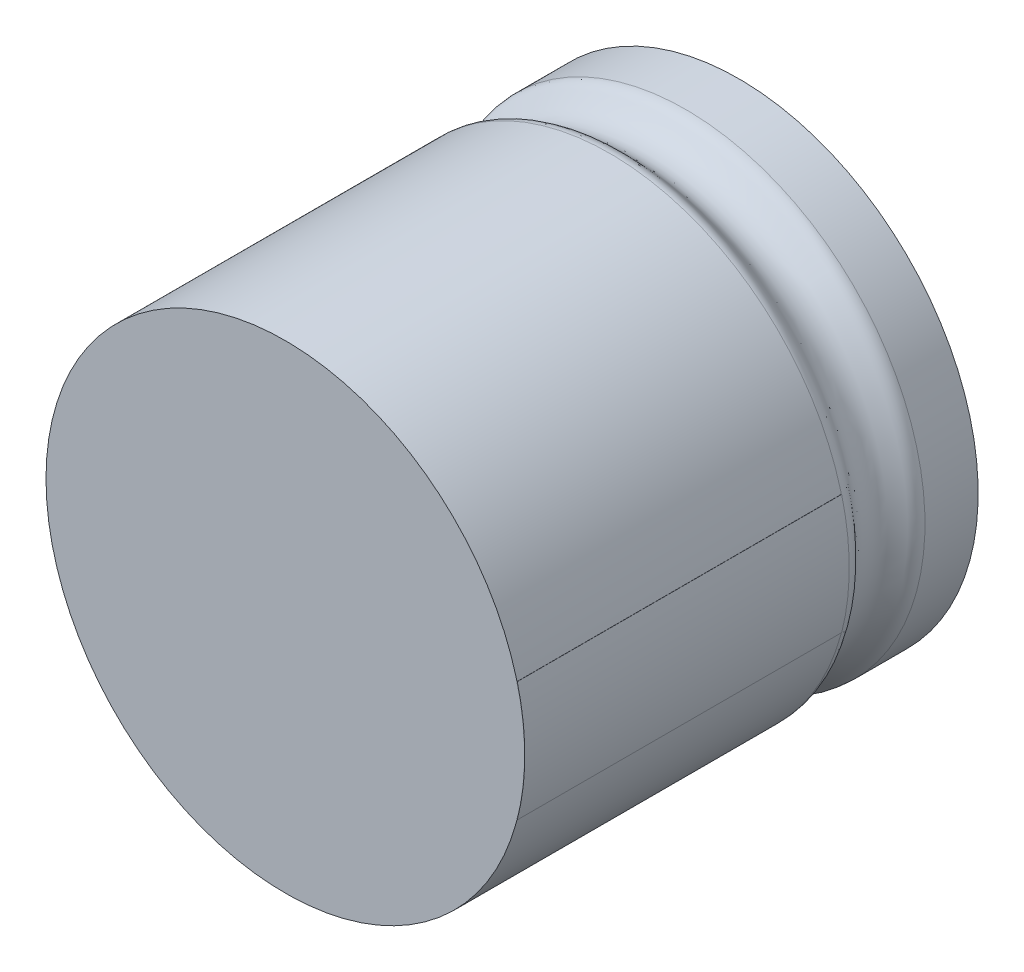
ISO-10303-21;
HEADER;
FILE_DESCRIPTION(('STEP AP214'),'2;1');
FILE_NAME('part.step','',(''),(''),'','','');
FILE_SCHEMA(('AUTOMOTIVE_DESIGN { 1 0 10303 214 1 1 1 1 }'));
ENDSEC;
DATA;
#1=APPLICATION_CONTEXT('core data for automotive mechanical design processes');
#2=APPLICATION_PROTOCOL_DEFINITION('international standard','automotive_design',2000,#1);
#3=PRODUCT_CONTEXT('',#1,'mechanical');
#4=PRODUCT('Part','Part','',(#3));
#5=PRODUCT_RELATED_PRODUCT_CATEGORY('part','',(#4));
#6=PRODUCT_DEFINITION_FORMATION('','',#4);
#7=PRODUCT_DEFINITION_CONTEXT('part definition',#1,'design');
#8=PRODUCT_DEFINITION('design','',#6,#7);
#9=PRODUCT_DEFINITION_SHAPE('','',#8);
#10=(LENGTH_UNIT() NAMED_UNIT(*) SI_UNIT(.MILLI.,.METRE.));
#11=(NAMED_UNIT(*) PLANE_ANGLE_UNIT() SI_UNIT($,.RADIAN.));
#12=(NAMED_UNIT(*) SI_UNIT($,.STERADIAN.) SOLID_ANGLE_UNIT());
#13=UNCERTAINTY_MEASURE_WITH_UNIT(LENGTH_MEASURE(1.E-05),#10,'distance_accuracy_value','');
#14=(GEOMETRIC_REPRESENTATION_CONTEXT(3) GLOBAL_UNCERTAINTY_ASSIGNED_CONTEXT((#13)) GLOBAL_UNIT_ASSIGNED_CONTEXT((#10,
#11,#12)) REPRESENTATION_CONTEXT('',''));
#15=CARTESIAN_POINT('',(0.,0.,0.));
#16=DIRECTION('',(0.,0.,1.));
#17=DIRECTION('',(1.,0.,0.));
#18=AXIS2_PLACEMENT_3D('',#15,#16,#17);
#19=CARTESIAN_POINT('',(5.08813187108,1.31375,21.34375));
#20=DIRECTION('',(-0.249999999999965,0.968245836551863,0.));
#21=DIRECTION('',(0.,0.,1.));
#22=AXIS2_PLACEMENT_3D('',#19,#20,#21);
#23=PLANE('',#22);
#24=DIRECTION('',(0.,0.,-1.));
#25=VECTOR('',#24,1.);
#26=CARTESIAN_POINT('',(5.083290641897,1.3125,21.34375));
#27=LINE('',#26,#25);
#28=CARTESIAN_POINT('',(5.083290641897,1.3125,9.950000000002));
#29=VERTEX_POINT('',#28);
#30=CARTESIAN_POINT('',(5.083290641897,1.3125,2.833333333333));
#31=VERTEX_POINT('',#30);
#32=EDGE_CURVE('P0_E108',#29,#31,#27,.T.);
#33=ORIENTED_EDGE('',*,*,#32,.F.);
#34=DIRECTION('',(0.968245836551863,0.249999999999965,0.));
#35=VECTOR('',#34,1.);
#36=CARTESIAN_POINT('',(5.08813187108,1.31375,9.950000000002));
#37=LINE('',#36,#35);
#38=CARTESIAN_POINT('',(5.08813187108,1.31375,9.950000000002));
#39=VERTEX_POINT('',#38);
#40=EDGE_CURVE('P0_E74',#29,#39,#37,.T.);
#41=ORIENTED_EDGE('',*,*,#40,.T.);
#42=DIRECTION('',(0.,0.,1.));
#43=VECTOR('',#42,1.);
#44=CARTESIAN_POINT('',(5.08813187108,1.31375,2.833333333333));
#45=LINE('',#44,#43);
#46=CARTESIAN_POINT('',(5.08813187108,1.31375,2.833333333333));
#47=VERTEX_POINT('',#46);
#48=EDGE_CURVE('P0_E112',#47,#39,#45,.T.);
#49=ORIENTED_EDGE('',*,*,#48,.F.);
#50=DIRECTION('',(0.968245836551863,0.249999999999965,0.));
#51=VECTOR('',#50,1.);
#52=CARTESIAN_POINT('',(5.083290641897,1.3125,2.833333333333));
#53=LINE('',#52,#51);
#54=EDGE_CURVE('P0_E99',#31,#47,#53,.T.);
#55=ORIENTED_EDGE('',*,*,#54,.F.);
#56=EDGE_LOOP('',(#33,#41,#49,#55));
#57=FACE_BOUND('',#56,.T.);
#58=ADVANCED_FACE('P0_F51',(#57),#23,.T.);
#59=CARTESIAN_POINT('',(5.08813187108,-1.31375,21.34375));
#60=DIRECTION('',(0.249999999999965,0.968245836551863,0.));
#61=DIRECTION('',(0.,0.,-1.));
#62=AXIS2_PLACEMENT_3D('',#59,#60,#61);
#63=PLANE('',#62);
#64=DIRECTION('',(0.968245836551863,-0.249999999999965,0.));
#65=VECTOR('',#64,1.);
#66=CARTESIAN_POINT('',(5.08813187108,-1.31375,9.950000000002));
#67=LINE('',#66,#65);
#68=CARTESIAN_POINT('',(5.08329064189722,-1.31250000000006,9.950000000002));
#69=VERTEX_POINT('',#68);
#70=CARTESIAN_POINT('',(5.08813187108,-1.31375,9.950000000002));
#71=VERTEX_POINT('',#70);
#72=EDGE_CURVE('P0_E102',#69,#71,#67,.T.);
#73=ORIENTED_EDGE('',*,*,#72,.F.);
#74=DIRECTION('',(0.,0.,-1.));
#75=VECTOR('',#74,1.);
#76=CARTESIAN_POINT('',(5.083290641897,-1.3125,21.34375));
#77=LINE('',#76,#75);
#78=CARTESIAN_POINT('',(5.083290641897,-1.3125,2.833333333333));
#79=VERTEX_POINT('',#78);
#80=EDGE_CURVE('P0_E92',#69,#79,#77,.T.);
#81=ORIENTED_EDGE('',*,*,#80,.T.);
#82=DIRECTION('',(0.968245836551863,-0.249999999999965,0.));
#83=VECTOR('',#82,1.);
#84=CARTESIAN_POINT('',(5.083290641897,-1.3125,2.833333333333));
#85=LINE('',#84,#83);
#86=CARTESIAN_POINT('',(5.08813187108,-1.31375,2.833333333333));
#87=VERTEX_POINT('',#86);
#88=EDGE_CURVE('P0_E113',#79,#87,#85,.T.);
#89=ORIENTED_EDGE('',*,*,#88,.T.);
#90=DIRECTION('',(0.,0.,1.));
#91=VECTOR('',#90,1.);
#92=CARTESIAN_POINT('',(5.08813187108,-1.31375,2.833333333333));
#93=LINE('',#92,#91);
#94=EDGE_CURVE('P0_E59',#87,#71,#93,.T.);
#95=ORIENTED_EDGE('',*,*,#94,.T.);
#96=EDGE_LOOP('',(#73,#81,#89,#95));
#97=FACE_BOUND('',#96,.T.);
#98=ADVANCED_FACE('P0_F103',(#97),#63,.F.);
#99=CARTESIAN_POINT('',(0.,0.,2.833333333333));
#100=DIRECTION('',(0.,0.,1.));
#101=DIRECTION('',(0.968245836551863,-0.249999999999965,0.));
#102=AXIS2_PLACEMENT_3D('',#99,#100,#101);
#103=CYLINDRICAL_SURFACE('',#102,5.255);
#104=ORIENTED_EDGE('',*,*,#48,.T.);
#105=CARTESIAN_POINT('',(0.,0.,9.950000000002));
#106=DIRECTION('',(0.,0.,1.));
#107=DIRECTION('',(1.,0.,0.));
#108=AXIS2_PLACEMENT_3D('',#105,#106,#107);
#109=CIRCLE('',#108,5.255);
#110=EDGE_CURVE('P0_E66',#39,#71,#109,.F.);
#111=ORIENTED_EDGE('',*,*,#110,.T.);
#112=ORIENTED_EDGE('',*,*,#94,.F.);
#113=CARTESIAN_POINT('',(0.,0.,2.833333333333));
#114=DIRECTION('',(0.,0.,1.));
#115=DIRECTION('',(0.968245836551863,-0.249999999999965,0.));
#116=AXIS2_PLACEMENT_3D('',#113,#114,#115);
#117=CIRCLE('',#116,5.255);
#118=EDGE_CURVE('P0_E115',#87,#47,#117,.T.);
#119=ORIENTED_EDGE('',*,*,#118,.T.);
#120=EDGE_LOOP('',(#104,#111,#112,#119));
#121=FACE_BOUND('',#120,.T.);
#122=ADVANCED_FACE('P0_F125',(#121),#103,.T.);
#123=CARTESIAN_POINT('',(0.,0.,21.34375));
#124=DIRECTION('',(0.,0.,-1.));
#125=DIRECTION('',(0.968245836551863,-0.249999999999965,0.));
#126=AXIS2_PLACEMENT_3D('',#123,#124,#125);
#127=CYLINDRICAL_SURFACE('',#126,5.25);
#128=CARTESIAN_POINT('',(0.,0.,9.950000000002));
#129=DIRECTION('',(0.,0.,1.));
#130=DIRECTION('',(1.,0.,0.));
#131=AXIS2_PLACEMENT_3D('',#128,#129,#130);
#132=CIRCLE('',#131,5.25);
#133=EDGE_CURVE('P0_E13',#29,#69,#132,.F.);
#134=ORIENTED_EDGE('',*,*,#133,.F.);
#135=ORIENTED_EDGE('',*,*,#32,.T.);
#136=CARTESIAN_POINT('',(0.,0.,2.833333333333));
#137=DIRECTION('',(0.,0.,1.));
#138=DIRECTION('',(0.968245836551863,-0.249999999999965,0.));
#139=AXIS2_PLACEMENT_3D('',#136,#137,#138);
#140=CIRCLE('',#139,5.25);
#141=EDGE_CURVE('P0_E95',#79,#31,#140,.T.);
#142=ORIENTED_EDGE('',*,*,#141,.F.);
#143=ORIENTED_EDGE('',*,*,#80,.F.);
#144=EDGE_LOOP('',(#134,#135,#142,#143));
#145=FACE_BOUND('',#144,.T.);
#146=ADVANCED_FACE('P0_F53',(#145),#127,.F.);
#147=CARTESIAN_POINT('',(0.,0.,2.833333333333));
#148=DIRECTION('',(0.,0.,1.));
#149=DIRECTION('',(1.,0.,0.));
#150=AXIS2_PLACEMENT_3D('',#147,#148,#149);
#151=PLANE('',#150);
#152=ORIENTED_EDGE('',*,*,#141,.T.);
#153=ORIENTED_EDGE('',*,*,#54,.T.);
#154=ORIENTED_EDGE('',*,*,#118,.F.);
#155=ORIENTED_EDGE('',*,*,#88,.F.);
#156=EDGE_LOOP('',(#152,#153,#154,#155));
#157=FACE_BOUND('',#156,.T.);
#158=ADVANCED_FACE('P0_F124',(#157),#151,.F.);
#159=CARTESIAN_POINT('',(0.,0.,9.950000000002));
#160=DIRECTION('',(0.,0.,1.));
#161=DIRECTION('',(1.,0.,0.));
#162=AXIS2_PLACEMENT_3D('',#159,#160,#161);
#163=PLANE('',#162);
#164=ORIENTED_EDGE('',*,*,#110,.F.);
#165=ORIENTED_EDGE('',*,*,#40,.F.);
#166=ORIENTED_EDGE('',*,*,#133,.T.);
#167=ORIENTED_EDGE('',*,*,#72,.T.);
#168=EDGE_LOOP('',(#164,#165,#166,#167));
#169=FACE_BOUND('',#168,.T.);
#170=ADVANCED_FACE('P0_F106',(#169),#163,.T.);
#171=CLOSED_SHELL('',(#58,#98,#122,#146,#158,#170));
#172=MANIFOLD_SOLID_BREP('P0_B2',#171);
#173=CARTESIAN_POINT('',(0.,0.,9.950000000002));
#174=DIRECTION('',(0.,0.,1.));
#175=DIRECTION('',(1.,0.,0.));
#176=AXIS2_PLACEMENT_3D('',#173,#174,#175);
#177=PLANE('',#176);
#178=CARTESIAN_POINT('',(0.,0.,9.950000000002));
#179=DIRECTION('',(0.,0.,1.));
#180=DIRECTION('',(1.,0.,0.));
#181=AXIS2_PLACEMENT_3D('',#178,#179,#180);
#182=CIRCLE('',#181,5.25);
#183=CARTESIAN_POINT('',(-5.25,0.,9.950000000002));
#184=VERTEX_POINT('',#183);
#185=EDGE_CURVE('P0_E178',#184,#184,#182,.F.);
#186=ORIENTED_EDGE('',*,*,#185,.F.);
#187=EDGE_LOOP('',(#186));
#188=FACE_BOUND('',#187,.T.);
#189=ADVANCED_FACE('P0_F174',(#188),#177,.T.);
#190=CARTESIAN_POINT('',(0.,0.,2.833333333333));
#191=DIRECTION('',(0.,0.,1.));
#192=DIRECTION('',(-1.,0.,0.));
#193=AXIS2_PLACEMENT_3D('',#190,#191,#192);
#194=CYLINDRICAL_SURFACE('',#193,5.25);
#195=DIRECTION('',(0.,0.,1.));
#196=VECTOR('',#195,1.);
#197=CARTESIAN_POINT('',(-5.25,0.,2.833333333333));
#198=LINE('',#197,#196);
#199=CARTESIAN_POINT('',(-5.25,0.,2.833333333333));
#200=VERTEX_POINT('',#199);
#201=EDGE_CURVE('P0_E49',#200,#184,#198,.T.);
#202=ORIENTED_EDGE('',*,*,#201,.T.);
#203=ORIENTED_EDGE('',*,*,#185,.T.);
#204=ORIENTED_EDGE('',*,*,#201,.F.);
#205=CARTESIAN_POINT('',(0.,0.,2.833333333333));
#206=DIRECTION('',(0.,0.,1.));
#207=DIRECTION('',(-1.,0.,0.));
#208=AXIS2_PLACEMENT_3D('',#205,#206,#207);
#209=CIRCLE('',#208,5.25);
#210=EDGE_CURVE('P0_E183',#200,#200,#209,.T.);
#211=ORIENTED_EDGE('',*,*,#210,.T.);
#212=EDGE_LOOP('',(#202,#203,#204,#211));
#213=FACE_BOUND('',#212,.T.);
#214=ADVANCED_FACE('P0_F222',(#213),#194,.T.);
#215=CARTESIAN_POINT('',(-5.25,0.,1.166666666667));
#216=CARTESIAN_POINT('',(-5.25,0.,1.5));
#217=CARTESIAN_POINT('',(-4.916666666667,0.,1.62732200375));
#218=CARTESIAN_POINT('',(-4.75,0.,1.5));
#219=CARTESIAN_POINT('',(-4.75,0.,2.));
#220=CARTESIAN_POINT('',(-4.75,0.,2.5));
#221=CARTESIAN_POINT('',(-4.916666666667,0.,2.37267799625));
#222=CARTESIAN_POINT('',(-5.25,0.,2.5));
#223=CARTESIAN_POINT('',(-5.25,0.,2.833333333333));
#224=(BOUNDED_CURVE() B_SPLINE_CURVE(8,(#215,#216,#217,#218,#219,#220,#221,#222,#223),
.UNSPECIFIED.,.F.,.F.) B_SPLINE_CURVE_WITH_KNOTS((9,9),(0.,1.),
.UNSPECIFIED.) CURVE() GEOMETRIC_REPRESENTATION_ITEM() RATIONAL_B_SPLINE_CURVE((1.,1.,1.,1.,1.,
1.,1.,1.,1.)) REPRESENTATION_ITEM(''));
#225=CARTESIAN_POINT('',(0.,0.,11.));
#226=DIRECTION('',(0.,0.,-1.));
#227=AXIS1_PLACEMENT('',#225,#226);
#228=SURFACE_OF_REVOLUTION('',#224,#227);
#229=CARTESIAN_POINT('',(0.,0.,1.166666666667));
#230=DIRECTION('',(0.,0.,1.));
#231=DIRECTION('',(-1.,0.,0.));
#232=AXIS2_PLACEMENT_3D('',#229,#230,#231);
#233=CIRCLE('',#232,5.25);
#234=CARTESIAN_POINT('',(-5.25,0.,1.166666666667));
#235=VERTEX_POINT('',#234);
#236=EDGE_CURVE('P0_E206',#235,#235,#233,.T.);
#237=ORIENTED_EDGE('',*,*,#236,.T.);
#238=CARTESIAN_POINT('',(-5.25,0.,1.166666666667));
#239=CARTESIAN_POINT('',(-5.25,0.,1.5));
#240=CARTESIAN_POINT('',(-4.916666666667,0.,1.62732200375));
#241=CARTESIAN_POINT('',(-4.75,0.,1.5));
#242=CARTESIAN_POINT('',(-4.75,0.,2.));
#243=CARTESIAN_POINT('',(-4.75,0.,2.5));
#244=CARTESIAN_POINT('',(-4.916666666667,0.,2.37267799625));
#245=CARTESIAN_POINT('',(-5.25,0.,2.5));
#246=CARTESIAN_POINT('',(-5.25,0.,2.833333333333));
#247=(BOUNDED_CURVE() B_SPLINE_CURVE(8,(#238,#239,#240,#241,#242,#243,#244,#245,#246),
.UNSPECIFIED.,.F.,.F.) B_SPLINE_CURVE_WITH_KNOTS((9,9),(0.,1.),
.UNSPECIFIED.) CURVE() GEOMETRIC_REPRESENTATION_ITEM() RATIONAL_B_SPLINE_CURVE((1.,1.,1.,1.,1.,
1.,1.,1.,1.)) REPRESENTATION_ITEM(''));
#248=EDGE_CURVE('P0_E208',#235,#200,#247,.T.);
#249=ORIENTED_EDGE('',*,*,#248,.T.);
#250=ORIENTED_EDGE('',*,*,#210,.F.);
#251=ORIENTED_EDGE('',*,*,#248,.F.);
#252=EDGE_LOOP('',(#237,#249,#250,#251));
#253=FACE_BOUND('',#252,.T.);
#254=ADVANCED_FACE('P0_F221',(#253),#228,.F.);
#255=CARTESIAN_POINT('',(0.,0.,0.));
#256=DIRECTION('',(0.,0.,1.));
#257=DIRECTION('',(-1.,0.,0.));
#258=AXIS2_PLACEMENT_3D('',#255,#256,#257);
#259=CYLINDRICAL_SURFACE('',#258,5.25);
#260=CARTESIAN_POINT('',(0.,0.,0.));
#261=DIRECTION('',(0.,0.,1.));
#262=DIRECTION('',(-1.,0.,0.));
#263=AXIS2_PLACEMENT_3D('',#260,#261,#262);
#264=CIRCLE('',#263,5.25);
#265=CARTESIAN_POINT('',(-5.25,0.,0.));
#266=VERTEX_POINT('',#265);
#267=EDGE_CURVE('P0_E204',#266,#266,#264,.T.);
#268=ORIENTED_EDGE('',*,*,#267,.T.);
#269=DIRECTION('',(0.,0.,1.));
#270=VECTOR('',#269,1.);
#271=CARTESIAN_POINT('',(-5.25,0.,0.));
#272=LINE('',#271,#270);
#273=EDGE_CURVE('P0_E202',#266,#235,#272,.T.);
#274=ORIENTED_EDGE('',*,*,#273,.T.);
#275=ORIENTED_EDGE('',*,*,#236,.F.);
#276=ORIENTED_EDGE('',*,*,#273,.F.);
#277=EDGE_LOOP('',(#268,#274,#275,#276));
#278=FACE_BOUND('',#277,.T.);
#279=ADVANCED_FACE('P0_F176',(#278),#259,.T.);
#280=CARTESIAN_POINT('',(0.,0.,0.));
#281=DIRECTION('',(0.,0.,1.));
#282=DIRECTION('',(1.,0.,0.));
#283=AXIS2_PLACEMENT_3D('',#280,#281,#282);
#284=PLANE('',#283);
#285=ORIENTED_EDGE('',*,*,#267,.F.);
#286=EDGE_LOOP('',(#285));
#287=FACE_BOUND('',#286,.T.);
#288=ADVANCED_FACE('P0_F231',(#287),#284,.F.);
#289=CLOSED_SHELL('',(#189,#214,#254,#279,#288));
#290=MANIFOLD_SOLID_BREP('P0_B7',#289);
#291=CARTESIAN_POINT('',(-2.5,0.,0.));
#292=DIRECTION('',(0.,0.,-1.));
#293=DIRECTION('',(0.,-1.,0.));
#294=AXIS2_PLACEMENT_3D('',#291,#292,#293);
#295=PLANE('',#294);
#296=CARTESIAN_POINT('',(-2.5,0.,0.));
#297=DIRECTION('',(0.,0.,-1.));
#298=DIRECTION('',(-1.,0.,0.));
#299=AXIS2_PLACEMENT_3D('',#296,#297,#298);
#300=CIRCLE('',#299,0.3);
#301=CARTESIAN_POINT('',(-2.8,0.,0.));
#302=VERTEX_POINT('',#301);
#303=EDGE_CURVE('P1_E11',#302,#302,#300,.T.);
#304=ORIENTED_EDGE('',*,*,#303,.F.);
#305=EDGE_LOOP('',(#304));
#306=FACE_BOUND('',#305,.T.);
#307=ADVANCED_FACE('P1_F16',(#306),#295,.F.);
#308=CARTESIAN_POINT('',(-2.5,0.,-2.));
#309=DIRECTION('',(0.,0.,-1.));
#310=DIRECTION('',(0.,-1.,0.));
#311=AXIS2_PLACEMENT_3D('',#308,#309,#310);
#312=PLANE('',#311);
#313=CARTESIAN_POINT('',(-2.5,0.,-2.));
#314=DIRECTION('',(0.,0.,-1.));
#315=DIRECTION('',(-1.,0.,0.));
#316=AXIS2_PLACEMENT_3D('',#313,#314,#315);
#317=CIRCLE('',#316,0.3);
#318=CARTESIAN_POINT('',(-2.8,0.,-2.));
#319=VERTEX_POINT('',#318);
#320=EDGE_CURVE('P1_E40',#319,#319,#317,.T.);
#321=ORIENTED_EDGE('',*,*,#320,.T.);
#322=EDGE_LOOP('',(#321));
#323=FACE_BOUND('',#322,.T.);
#324=ADVANCED_FACE('P1_F44',(#323),#312,.T.);
#325=CARTESIAN_POINT('',(-2.5,0.,0.));
#326=DIRECTION('',(0.,0.,-1.));
#327=DIRECTION('',(-1.,0.,0.));
#328=AXIS2_PLACEMENT_3D('',#325,#326,#327);
#329=CYLINDRICAL_SURFACE('',#328,0.3);
#330=ORIENTED_EDGE('',*,*,#320,.F.);
#331=DIRECTION('',(0.,0.,-1.));
#332=VECTOR('',#331,1.);
#333=CARTESIAN_POINT('',(-2.8,0.,0.));
#334=LINE('',#333,#332);
#335=EDGE_CURVE('P1_E25',#302,#319,#334,.T.);
#336=ORIENTED_EDGE('',*,*,#335,.F.);
#337=ORIENTED_EDGE('',*,*,#303,.T.);
#338=ORIENTED_EDGE('',*,*,#335,.T.);
#339=EDGE_LOOP('',(#330,#336,#337,#338));
#340=FACE_BOUND('',#339,.T.);
#341=ADVANCED_FACE('P1_F39',(#340),#329,.T.);
#342=CLOSED_SHELL('',(#307,#324,#341));
#343=MANIFOLD_SOLID_BREP('P1_B1',#342);
#344=CARTESIAN_POINT('',(2.5,0.,0.));
#345=DIRECTION('',(0.,0.,-1.));
#346=DIRECTION('',(0.,-1.,0.));
#347=AXIS2_PLACEMENT_3D('',#344,#345,#346);
#348=PLANE('',#347);
#349=CARTESIAN_POINT('',(2.5,0.,0.));
#350=DIRECTION('',(0.,0.,-1.));
#351=DIRECTION('',(-1.,0.,0.));
#352=AXIS2_PLACEMENT_3D('',#349,#350,#351);
#353=CIRCLE('',#352,0.3);
#354=CARTESIAN_POINT('',(2.2,0.,0.));
#355=VERTEX_POINT('',#354);
#356=EDGE_CURVE('P2_E11',#355,#355,#353,.T.);
#357=ORIENTED_EDGE('',*,*,#356,.F.);
#358=EDGE_LOOP('',(#357));
#359=FACE_BOUND('',#358,.T.);
#360=ADVANCED_FACE('P2_F16',(#359),#348,.F.);
#361=CARTESIAN_POINT('',(2.5,0.,-2.));
#362=DIRECTION('',(0.,0.,-1.));
#363=DIRECTION('',(0.,-1.,0.));
#364=AXIS2_PLACEMENT_3D('',#361,#362,#363);
#365=PLANE('',#364);
#366=CARTESIAN_POINT('',(2.5,0.,-2.));
#367=DIRECTION('',(0.,0.,-1.));
#368=DIRECTION('',(-1.,0.,0.));
#369=AXIS2_PLACEMENT_3D('',#366,#367,#368);
#370=CIRCLE('',#369,0.3);
#371=CARTESIAN_POINT('',(2.2,0.,-2.));
#372=VERTEX_POINT('',#371);
#373=EDGE_CURVE('P2_E42',#372,#372,#370,.T.);
#374=ORIENTED_EDGE('',*,*,#373,.T.);
#375=EDGE_LOOP('',(#374));
#376=FACE_BOUND('',#375,.T.);
#377=ADVANCED_FACE('P2_F18',(#376),#365,.T.);
#378=CARTESIAN_POINT('',(2.5,0.,0.));
#379=DIRECTION('',(0.,0.,-1.));
#380=DIRECTION('',(-1.,0.,0.));
#381=AXIS2_PLACEMENT_3D('',#378,#379,#380);
#382=CYLINDRICAL_SURFACE('',#381,0.3);
#383=ORIENTED_EDGE('',*,*,#373,.F.);
#384=DIRECTION('',(0.,0.,-1.));
#385=VECTOR('',#384,1.);
#386=CARTESIAN_POINT('',(2.2,0.,0.));
#387=LINE('',#386,#385);
#388=EDGE_CURVE('P2_E20',#355,#372,#387,.T.);
#389=ORIENTED_EDGE('',*,*,#388,.F.);
#390=ORIENTED_EDGE('',*,*,#356,.T.);
#391=ORIENTED_EDGE('',*,*,#388,.T.);
#392=EDGE_LOOP('',(#383,#389,#390,#391));
#393=FACE_BOUND('',#392,.T.);
#394=ADVANCED_FACE('P2_F41',(#393),#382,.T.);
#395=CLOSED_SHELL('',(#360,#377,#394));
#396=MANIFOLD_SOLID_BREP('P2_B1',#395);
#397=ADVANCED_BREP_SHAPE_REPRESENTATION('',(#18,#172,#290,#343,#396),#14);
#398=SHAPE_DEFINITION_REPRESENTATION(#9,#397);
ENDSEC;
END-ISO-10303-21;
